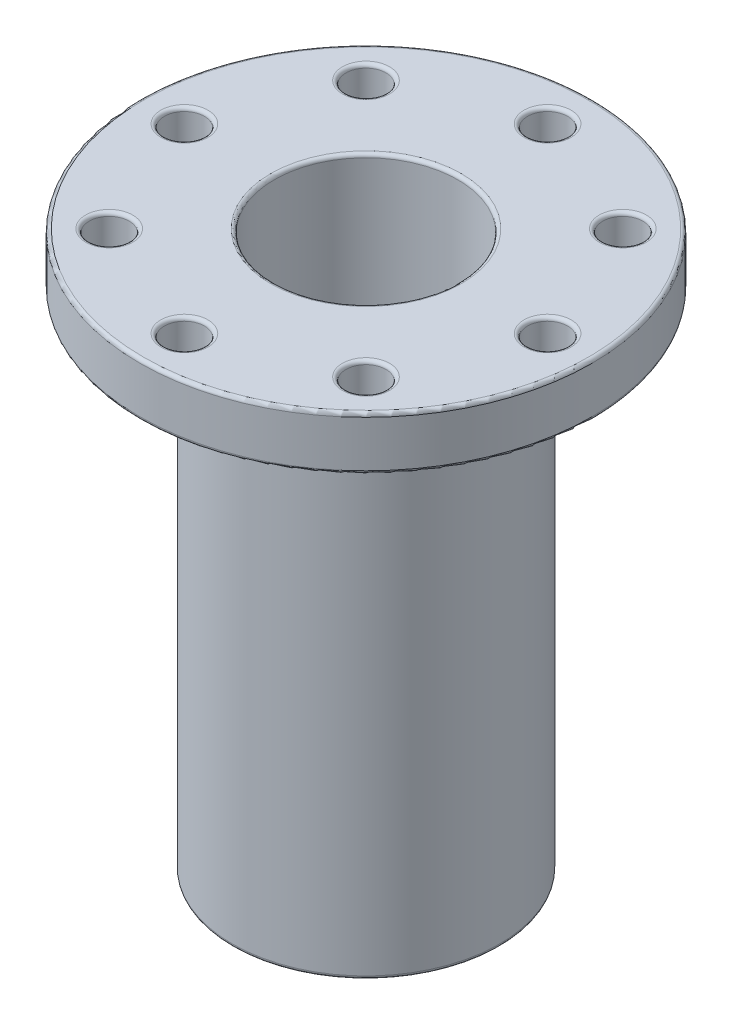
ISO-10303-21;
HEADER;
FILE_DESCRIPTION(('STEP AP214'),'2;1');
FILE_NAME('part.step','',(''),(''),'','','');
FILE_SCHEMA(('AUTOMOTIVE_DESIGN { 1 0 10303 214 1 1 1 1 }'));
ENDSEC;
DATA;
#1=APPLICATION_CONTEXT('core data for automotive mechanical design processes');
#2=APPLICATION_PROTOCOL_DEFINITION('international standard','automotive_design',2000,#1);
#3=PRODUCT_CONTEXT('',#1,'mechanical');
#4=PRODUCT('Part','Part','',(#3));
#5=PRODUCT_RELATED_PRODUCT_CATEGORY('part','',(#4));
#6=PRODUCT_DEFINITION_FORMATION('','',#4);
#7=PRODUCT_DEFINITION_CONTEXT('part definition',#1,'design');
#8=PRODUCT_DEFINITION('design','',#6,#7);
#9=PRODUCT_DEFINITION_SHAPE('','',#8);
#10=(LENGTH_UNIT() NAMED_UNIT(*) SI_UNIT(.MILLI.,.METRE.));
#11=(NAMED_UNIT(*) PLANE_ANGLE_UNIT() SI_UNIT($,.RADIAN.));
#12=(NAMED_UNIT(*) SI_UNIT($,.STERADIAN.) SOLID_ANGLE_UNIT());
#13=UNCERTAINTY_MEASURE_WITH_UNIT(LENGTH_MEASURE(1.E-05),#10,'distance_accuracy_value','');
#14=(GEOMETRIC_REPRESENTATION_CONTEXT(3) GLOBAL_UNCERTAINTY_ASSIGNED_CONTEXT((#13)) GLOBAL_UNIT_ASSIGNED_CONTEXT((#10,
#11,#12)) REPRESENTATION_CONTEXT('',''));
#15=CARTESIAN_POINT('',(0.,0.,0.));
#16=DIRECTION('',(0.,0.,1.));
#17=DIRECTION('',(1.,0.,0.));
#18=AXIS2_PLACEMENT_3D('',#15,#16,#17);
#19=CARTESIAN_POINT('',(0.,6.,0.));
#20=DIRECTION('',(0.,1.,0.));
#21=DIRECTION('',(0.,0.,1.));
#22=AXIS2_PLACEMENT_3D('',#19,#20,#21);
#23=PLANE('',#22);
#24=CARTESIAN_POINT('',(-14.4249783362056,6.,-14.4249783362056));
#25=DIRECTION('',(0.,1.,0.));
#26=DIRECTION('',(0.,0.,1.));
#27=AXIS2_PLACEMENT_3D('',#24,#25,#26);
#28=CIRCLE('',#27,2.65);
#29=CARTESIAN_POINT('',(-14.4249783362056,6.,-11.7749783362056));
#30=VERTEX_POINT('',#29);
#31=EDGE_CURVE('E191',#30,#30,#28,.F.);
#32=ORIENTED_EDGE('',*,*,#31,.T.);
#33=EDGE_LOOP('',(#32));
#34=FACE_BOUND('',#33,.T.);
#35=CARTESIAN_POINT('',(-14.4249783362056,6.,14.4249783362056));
#36=DIRECTION('',(0.,1.,0.));
#37=DIRECTION('',(0.,0.,1.));
#38=AXIS2_PLACEMENT_3D('',#35,#36,#37);
#39=CIRCLE('',#38,2.65);
#40=CARTESIAN_POINT('',(-14.4249783362056,6.,17.0749783362056));
#41=VERTEX_POINT('',#40);
#42=EDGE_CURVE('E195',#41,#41,#39,.F.);
#43=ORIENTED_EDGE('',*,*,#42,.T.);
#44=EDGE_LOOP('',(#43));
#45=FACE_BOUND('',#44,.T.);
#46=CARTESIAN_POINT('',(14.4249783362056,6.,14.4249783362056));
#47=DIRECTION('',(0.,1.,0.));
#48=DIRECTION('',(0.,0.,1.));
#49=AXIS2_PLACEMENT_3D('',#46,#47,#48);
#50=CIRCLE('',#49,2.65);
#51=CARTESIAN_POINT('',(14.4249783362056,6.,17.0749783362056));
#52=VERTEX_POINT('',#51);
#53=EDGE_CURVE('E199',#52,#52,#50,.F.);
#54=ORIENTED_EDGE('',*,*,#53,.T.);
#55=EDGE_LOOP('',(#54));
#56=FACE_BOUND('',#55,.T.);
#57=CARTESIAN_POINT('',(14.4249783362056,6.,-14.4249783362056));
#58=DIRECTION('',(0.,1.,0.));
#59=DIRECTION('',(0.,0.,1.));
#60=AXIS2_PLACEMENT_3D('',#57,#58,#59);
#61=CIRCLE('',#60,2.65);
#62=CARTESIAN_POINT('',(14.4249783362056,6.,-11.7749783362056));
#63=VERTEX_POINT('',#62);
#64=EDGE_CURVE('E203',#63,#63,#61,.F.);
#65=ORIENTED_EDGE('',*,*,#64,.T.);
#66=EDGE_LOOP('',(#65));
#67=FACE_BOUND('',#66,.T.);
#68=CARTESIAN_POINT('',(0.,6.,0.));
#69=DIRECTION('',(0.,1.,0.));
#70=DIRECTION('',(0.,0.,1.));
#71=AXIS2_PLACEMENT_3D('',#68,#69,#70);
#72=CIRCLE('',#71,25.);
#73=CARTESIAN_POINT('',(0.,6.,25.));
#74=VERTEX_POINT('',#73);
#75=EDGE_CURVE('E207',#74,#74,#72,.T.);
#76=ORIENTED_EDGE('',*,*,#75,.T.);
#77=EDGE_LOOP('',(#76));
#78=FACE_BOUND('',#77,.T.);
#79=CARTESIAN_POINT('',(0.,6.,-20.4));
#80=DIRECTION('',(0.,1.,0.));
#81=DIRECTION('',(0.,0.,1.));
#82=AXIS2_PLACEMENT_3D('',#79,#80,#81);
#83=CIRCLE('',#82,2.65);
#84=CARTESIAN_POINT('',(0.,6.,-17.75));
#85=VERTEX_POINT('',#84);
#86=EDGE_CURVE('E211',#85,#85,#83,.F.);
#87=ORIENTED_EDGE('',*,*,#86,.T.);
#88=EDGE_LOOP('',(#87));
#89=FACE_BOUND('',#88,.T.);
#90=CARTESIAN_POINT('',(20.4,6.,0.));
#91=DIRECTION('',(0.,1.,0.));
#92=DIRECTION('',(0.,0.,1.));
#93=AXIS2_PLACEMENT_3D('',#90,#91,#92);
#94=CIRCLE('',#93,2.65);
#95=CARTESIAN_POINT('',(20.4,6.,2.65));
#96=VERTEX_POINT('',#95);
#97=EDGE_CURVE('E215',#96,#96,#94,.F.);
#98=ORIENTED_EDGE('',*,*,#97,.T.);
#99=EDGE_LOOP('',(#98));
#100=FACE_BOUND('',#99,.T.);
#101=CARTESIAN_POINT('',(0.,6.,20.4));
#102=DIRECTION('',(0.,1.,0.));
#103=DIRECTION('',(0.,0.,1.));
#104=AXIS2_PLACEMENT_3D('',#101,#102,#103);
#105=CIRCLE('',#104,2.65);
#106=CARTESIAN_POINT('',(0.,6.,23.05));
#107=VERTEX_POINT('',#106);
#108=EDGE_CURVE('E219',#107,#107,#105,.F.);
#109=ORIENTED_EDGE('',*,*,#108,.T.);
#110=EDGE_LOOP('',(#109));
#111=FACE_BOUND('',#110,.T.);
#112=CARTESIAN_POINT('',(-20.4,6.,0.));
#113=DIRECTION('',(0.,1.,0.));
#114=DIRECTION('',(0.,0.,1.));
#115=AXIS2_PLACEMENT_3D('',#112,#113,#114);
#116=CIRCLE('',#115,2.65);
#117=CARTESIAN_POINT('',(-20.4,6.,2.65));
#118=VERTEX_POINT('',#117);
#119=EDGE_CURVE('E223',#118,#118,#116,.F.);
#120=ORIENTED_EDGE('',*,*,#119,.T.);
#121=EDGE_LOOP('',(#120));
#122=FACE_BOUND('',#121,.T.);
#123=CARTESIAN_POINT('',(0.,6.,0.));
#124=DIRECTION('',(0.,1.,0.));
#125=DIRECTION('',(0.,0.,1.));
#126=AXIS2_PLACEMENT_3D('',#123,#124,#125);
#127=CIRCLE('',#126,10.7125);
#128=CARTESIAN_POINT('',(0.,6.,10.7125));
#129=VERTEX_POINT('',#128);
#130=EDGE_CURVE('E227',#129,#129,#127,.F.);
#131=ORIENTED_EDGE('',*,*,#130,.T.);
#132=EDGE_LOOP('',(#131));
#133=FACE_BOUND('',#132,.T.);
#134=ADVANCED_FACE('F39',(#34,#45,#56,#67,#78,#89,#100,#111,#122,#133),#23,.T.);
#135=CARTESIAN_POINT('',(0.,0.,0.));
#136=DIRECTION('',(0.,1.,0.));
#137=DIRECTION('',(0.,0.,1.));
#138=AXIS2_PLACEMENT_3D('',#135,#136,#137);
#139=PLANE('',#138);
#140=CARTESIAN_POINT('',(-14.4249783362056,0.,-14.4249783362056));
#141=DIRECTION('',(0.,1.,0.));
#142=DIRECTION('',(0.,0.,1.));
#143=AXIS2_PLACEMENT_3D('',#140,#141,#142);
#144=CIRCLE('',#143,2.65);
#145=CARTESIAN_POINT('',(-14.4249783362056,0.,-11.7749783362056));
#146=VERTEX_POINT('',#145);
#147=EDGE_CURVE('E87',#146,#146,#144,.T.);
#148=ORIENTED_EDGE('',*,*,#147,.T.);
#149=EDGE_LOOP('',(#148));
#150=FACE_BOUND('',#149,.T.);
#151=CARTESIAN_POINT('',(-20.4,0.,0.));
#152=DIRECTION('',(0.,1.,0.));
#153=DIRECTION('',(0.,0.,1.));
#154=AXIS2_PLACEMENT_3D('',#151,#152,#153);
#155=CIRCLE('',#154,2.65);
#156=CARTESIAN_POINT('',(-20.4,0.,2.65));
#157=VERTEX_POINT('',#156);
#158=EDGE_CURVE('E91',#157,#157,#155,.T.);
#159=ORIENTED_EDGE('',*,*,#158,.T.);
#160=EDGE_LOOP('',(#159));
#161=FACE_BOUND('',#160,.T.);
#162=CARTESIAN_POINT('',(-14.4249783362056,0.,14.4249783362056));
#163=DIRECTION('',(0.,1.,0.));
#164=DIRECTION('',(0.,0.,1.));
#165=AXIS2_PLACEMENT_3D('',#162,#163,#164);
#166=CIRCLE('',#165,2.65);
#167=CARTESIAN_POINT('',(-14.4249783362056,0.,17.0749783362056));
#168=VERTEX_POINT('',#167);
#169=EDGE_CURVE('E95',#168,#168,#166,.T.);
#170=ORIENTED_EDGE('',*,*,#169,.T.);
#171=EDGE_LOOP('',(#170));
#172=FACE_BOUND('',#171,.T.);
#173=CARTESIAN_POINT('',(0.,0.,20.4));
#174=DIRECTION('',(0.,1.,0.));
#175=DIRECTION('',(0.,0.,1.));
#176=AXIS2_PLACEMENT_3D('',#173,#174,#175);
#177=CIRCLE('',#176,2.65);
#178=CARTESIAN_POINT('',(0.,0.,23.05));
#179=VERTEX_POINT('',#178);
#180=EDGE_CURVE('E99',#179,#179,#177,.T.);
#181=ORIENTED_EDGE('',*,*,#180,.T.);
#182=EDGE_LOOP('',(#181));
#183=FACE_BOUND('',#182,.T.);
#184=CARTESIAN_POINT('',(14.4249783362056,0.,14.4249783362056));
#185=DIRECTION('',(0.,1.,0.));
#186=DIRECTION('',(0.,0.,1.));
#187=AXIS2_PLACEMENT_3D('',#184,#185,#186);
#188=CIRCLE('',#187,2.65);
#189=CARTESIAN_POINT('',(14.4249783362056,0.,17.0749783362056));
#190=VERTEX_POINT('',#189);
#191=EDGE_CURVE('E103',#190,#190,#188,.T.);
#192=ORIENTED_EDGE('',*,*,#191,.T.);
#193=EDGE_LOOP('',(#192));
#194=FACE_BOUND('',#193,.T.);
#195=CARTESIAN_POINT('',(20.4,0.,0.));
#196=DIRECTION('',(0.,1.,0.));
#197=DIRECTION('',(0.,0.,1.));
#198=AXIS2_PLACEMENT_3D('',#195,#196,#197);
#199=CIRCLE('',#198,2.65);
#200=CARTESIAN_POINT('',(20.4,0.,2.65));
#201=VERTEX_POINT('',#200);
#202=EDGE_CURVE('E107',#201,#201,#199,.T.);
#203=ORIENTED_EDGE('',*,*,#202,.T.);
#204=EDGE_LOOP('',(#203));
#205=FACE_BOUND('',#204,.T.);
#206=CARTESIAN_POINT('',(14.4249783362056,0.,-14.4249783362056));
#207=DIRECTION('',(0.,1.,0.));
#208=DIRECTION('',(0.,0.,1.));
#209=AXIS2_PLACEMENT_3D('',#206,#207,#208);
#210=CIRCLE('',#209,2.65);
#211=CARTESIAN_POINT('',(14.4249783362056,0.,-11.7749783362056));
#212=VERTEX_POINT('',#211);
#213=EDGE_CURVE('E111',#212,#212,#210,.T.);
#214=ORIENTED_EDGE('',*,*,#213,.T.);
#215=EDGE_LOOP('',(#214));
#216=FACE_BOUND('',#215,.T.);
#217=CARTESIAN_POINT('',(0.,0.,-20.4));
#218=DIRECTION('',(0.,1.,0.));
#219=DIRECTION('',(0.,0.,1.));
#220=AXIS2_PLACEMENT_3D('',#217,#218,#219);
#221=CIRCLE('',#220,2.65);
#222=CARTESIAN_POINT('',(0.,0.,-17.75));
#223=VERTEX_POINT('',#222);
#224=EDGE_CURVE('E115',#223,#223,#221,.T.);
#225=ORIENTED_EDGE('',*,*,#224,.T.);
#226=EDGE_LOOP('',(#225));
#227=FACE_BOUND('',#226,.T.);
#228=CARTESIAN_POINT('',(0.,0.,0.));
#229=DIRECTION('',(0.,1.,0.));
#230=DIRECTION('',(0.,0.,1.));
#231=AXIS2_PLACEMENT_3D('',#228,#229,#230);
#232=CIRCLE('',#231,25.);
#233=CARTESIAN_POINT('',(0.,0.,25.));
#234=VERTEX_POINT('',#233);
#235=EDGE_CURVE('E119',#234,#234,#232,.F.);
#236=ORIENTED_EDGE('',*,*,#235,.T.);
#237=EDGE_LOOP('',(#236));
#238=FACE_BOUND('',#237,.T.);
#239=CARTESIAN_POINT('',(0.,0.,0.));
#240=DIRECTION('',(0.,1.,0.));
#241=DIRECTION('',(0.,0.,1.));
#242=AXIS2_PLACEMENT_3D('',#239,#240,#241);
#243=CIRCLE('',#242,15.4);
#244=CARTESIAN_POINT('',(0.,0.,15.4));
#245=VERTEX_POINT('',#244);
#246=EDGE_CURVE('E123',#245,#245,#243,.T.);
#247=ORIENTED_EDGE('',*,*,#246,.T.);
#248=EDGE_LOOP('',(#247));
#249=FACE_BOUND('',#248,.T.);
#250=ADVANCED_FACE('F250',(#150,#161,#172,#183,#194,#205,#216,#227,#238,#249),#139,.F.);
#251=CARTESIAN_POINT('',(0.,6.,0.));
#252=DIRECTION('',(0.,-1.,0.));
#253=DIRECTION('',(0.,0.,-1.));
#254=AXIS2_PLACEMENT_3D('',#251,#252,#253);
#255=CYLINDRICAL_SURFACE('',#254,25.4);
#256=CARTESIAN_POINT('',(0.,5.6,0.));
#257=DIRECTION('',(0.,1.,0.));
#258=DIRECTION('',(0.,0.,1.));
#259=AXIS2_PLACEMENT_3D('',#256,#257,#258);
#260=CIRCLE('',#259,25.4);
#261=CARTESIAN_POINT('',(0.,5.6,25.4));
#262=VERTEX_POINT('',#261);
#263=EDGE_CURVE('E159',#262,#262,#260,.F.);
#264=ORIENTED_EDGE('',*,*,#263,.T.);
#265=EDGE_LOOP('',(#264));
#266=FACE_BOUND('',#265,.T.);
#267=CARTESIAN_POINT('',(0.,0.4,0.));
#268=DIRECTION('',(0.,1.,0.));
#269=DIRECTION('',(0.,0.,1.));
#270=AXIS2_PLACEMENT_3D('',#267,#268,#269);
#271=CIRCLE('',#270,25.4);
#272=CARTESIAN_POINT('',(0.,0.4,25.4));
#273=VERTEX_POINT('',#272);
#274=EDGE_CURVE('E163',#273,#273,#271,.T.);
#275=ORIENTED_EDGE('',*,*,#274,.T.);
#276=EDGE_LOOP('',(#275));
#277=FACE_BOUND('',#276,.T.);
#278=ADVANCED_FACE('F253',(#266,#277),#255,.T.);
#279=CARTESIAN_POINT('',(0.,6.,-20.4));
#280=DIRECTION('',(0.,-1.,0.));
#281=DIRECTION('',(0.,0.,-1.));
#282=AXIS2_PLACEMENT_3D('',#279,#280,#281);
#283=CYLINDRICAL_SURFACE('',#282,2.25);
#284=CARTESIAN_POINT('',(0.,5.6,-20.4));
#285=DIRECTION('',(0.,1.,0.));
#286=DIRECTION('',(0.,0.,1.));
#287=AXIS2_PLACEMENT_3D('',#284,#285,#286);
#288=CIRCLE('',#287,2.25);
#289=CARTESIAN_POINT('',(0.,5.6,-18.15));
#290=VERTEX_POINT('',#289);
#291=EDGE_CURVE('E151',#290,#290,#288,.T.);
#292=ORIENTED_EDGE('',*,*,#291,.T.);
#293=EDGE_LOOP('',(#292));
#294=FACE_BOUND('',#293,.T.);
#295=CARTESIAN_POINT('',(0.,0.4,-20.4));
#296=DIRECTION('',(0.,1.,0.));
#297=DIRECTION('',(0.,0.,1.));
#298=AXIS2_PLACEMENT_3D('',#295,#296,#297);
#299=CIRCLE('',#298,2.25);
#300=CARTESIAN_POINT('',(0.,0.4,-18.15));
#301=VERTEX_POINT('',#300);
#302=EDGE_CURVE('E155',#301,#301,#299,.F.);
#303=ORIENTED_EDGE('',*,*,#302,.T.);
#304=EDGE_LOOP('',(#303));
#305=FACE_BOUND('',#304,.T.);
#306=ADVANCED_FACE('F297',(#294,#305),#283,.F.);
#307=CARTESIAN_POINT('',(14.4249783362056,6.,-14.4249783362056));
#308=DIRECTION('',(0.,-1.,0.));
#309=DIRECTION('',(0.,0.,-1.));
#310=AXIS2_PLACEMENT_3D('',#307,#308,#309);
#311=CYLINDRICAL_SURFACE('',#310,2.25);
#312=CARTESIAN_POINT('',(14.4249783362056,5.6,-14.4249783362056));
#313=DIRECTION('',(0.,1.,0.));
#314=DIRECTION('',(0.,0.,1.));
#315=AXIS2_PLACEMENT_3D('',#312,#313,#314);
#316=CIRCLE('',#315,2.25);
#317=CARTESIAN_POINT('',(14.4249783362056,5.6,-12.1749783362056));
#318=VERTEX_POINT('',#317);
#319=EDGE_CURVE('E167',#318,#318,#316,.T.);
#320=ORIENTED_EDGE('',*,*,#319,.T.);
#321=EDGE_LOOP('',(#320));
#322=FACE_BOUND('',#321,.T.);
#323=CARTESIAN_POINT('',(14.4249783362056,0.4,-14.4249783362056));
#324=DIRECTION('',(0.,1.,0.));
#325=DIRECTION('',(0.,0.,1.));
#326=AXIS2_PLACEMENT_3D('',#323,#324,#325);
#327=CIRCLE('',#326,2.25);
#328=CARTESIAN_POINT('',(14.4249783362056,0.4,-12.1749783362056));
#329=VERTEX_POINT('',#328);
#330=EDGE_CURVE('E171',#329,#329,#327,.F.);
#331=ORIENTED_EDGE('',*,*,#330,.T.);
#332=EDGE_LOOP('',(#331));
#333=FACE_BOUND('',#332,.T.);
#334=ADVANCED_FACE('F370',(#322,#333),#311,.F.);
#335=CARTESIAN_POINT('',(20.4,6.,0.));
#336=DIRECTION('',(0.,-1.,0.));
#337=DIRECTION('',(0.,0.,-1.));
#338=AXIS2_PLACEMENT_3D('',#335,#336,#337);
#339=CYLINDRICAL_SURFACE('',#338,2.25);
#340=CARTESIAN_POINT('',(20.4,5.6,0.));
#341=DIRECTION('',(0.,1.,0.));
#342=DIRECTION('',(0.,0.,1.));
#343=AXIS2_PLACEMENT_3D('',#340,#341,#342);
#344=CIRCLE('',#343,2.25);
#345=CARTESIAN_POINT('',(20.4,5.6,2.25));
#346=VERTEX_POINT('',#345);
#347=EDGE_CURVE('E143',#346,#346,#344,.T.);
#348=ORIENTED_EDGE('',*,*,#347,.T.);
#349=EDGE_LOOP('',(#348));
#350=FACE_BOUND('',#349,.T.);
#351=CARTESIAN_POINT('',(20.4,0.4,0.));
#352=DIRECTION('',(0.,1.,0.));
#353=DIRECTION('',(0.,0.,1.));
#354=AXIS2_PLACEMENT_3D('',#351,#352,#353);
#355=CIRCLE('',#354,2.25);
#356=CARTESIAN_POINT('',(20.4,0.4,2.25));
#357=VERTEX_POINT('',#356);
#358=EDGE_CURVE('E147',#357,#357,#355,.F.);
#359=ORIENTED_EDGE('',*,*,#358,.T.);
#360=EDGE_LOOP('',(#359));
#361=FACE_BOUND('',#360,.T.);
#362=ADVANCED_FACE('F375',(#350,#361),#339,.F.);
#363=CARTESIAN_POINT('',(14.4249783362056,6.,14.4249783362056));
#364=DIRECTION('',(0.,-1.,0.));
#365=DIRECTION('',(0.,0.,-1.));
#366=AXIS2_PLACEMENT_3D('',#363,#364,#365);
#367=CYLINDRICAL_SURFACE('',#366,2.25);
#368=CARTESIAN_POINT('',(14.4249783362056,5.6,14.4249783362056));
#369=DIRECTION('',(0.,1.,0.));
#370=DIRECTION('',(0.,0.,1.));
#371=AXIS2_PLACEMENT_3D('',#368,#369,#370);
#372=CIRCLE('',#371,2.25);
#373=CARTESIAN_POINT('',(14.4249783362056,5.6,16.6749783362056));
#374=VERTEX_POINT('',#373);
#375=EDGE_CURVE('E175',#374,#374,#372,.T.);
#376=ORIENTED_EDGE('',*,*,#375,.T.);
#377=EDGE_LOOP('',(#376));
#378=FACE_BOUND('',#377,.T.);
#379=CARTESIAN_POINT('',(14.4249783362056,0.4,14.4249783362056));
#380=DIRECTION('',(0.,1.,0.));
#381=DIRECTION('',(0.,0.,1.));
#382=AXIS2_PLACEMENT_3D('',#379,#380,#381);
#383=CIRCLE('',#382,2.25);
#384=CARTESIAN_POINT('',(14.4249783362056,0.4,16.6749783362056));
#385=VERTEX_POINT('',#384);
#386=EDGE_CURVE('E179',#385,#385,#383,.F.);
#387=ORIENTED_EDGE('',*,*,#386,.T.);
#388=EDGE_LOOP('',(#387));
#389=FACE_BOUND('',#388,.T.);
#390=ADVANCED_FACE('F382',(#378,#389),#367,.F.);
#391=CARTESIAN_POINT('',(0.,6.,20.4));
#392=DIRECTION('',(0.,-1.,0.));
#393=DIRECTION('',(0.,0.,-1.));
#394=AXIS2_PLACEMENT_3D('',#391,#392,#393);
#395=CYLINDRICAL_SURFACE('',#394,2.25);
#396=CARTESIAN_POINT('',(0.,5.6,20.4));
#397=DIRECTION('',(0.,1.,0.));
#398=DIRECTION('',(0.,0.,1.));
#399=AXIS2_PLACEMENT_3D('',#396,#397,#398);
#400=CIRCLE('',#399,2.25);
#401=CARTESIAN_POINT('',(0.,5.6,22.65));
#402=VERTEX_POINT('',#401);
#403=EDGE_CURVE('E135',#402,#402,#400,.T.);
#404=ORIENTED_EDGE('',*,*,#403,.T.);
#405=EDGE_LOOP('',(#404));
#406=FACE_BOUND('',#405,.T.);
#407=CARTESIAN_POINT('',(0.,0.4,20.4));
#408=DIRECTION('',(0.,1.,0.));
#409=DIRECTION('',(0.,0.,1.));
#410=AXIS2_PLACEMENT_3D('',#407,#408,#409);
#411=CIRCLE('',#410,2.25);
#412=CARTESIAN_POINT('',(0.,0.4,22.65));
#413=VERTEX_POINT('',#412);
#414=EDGE_CURVE('E139',#413,#413,#411,.F.);
#415=ORIENTED_EDGE('',*,*,#414,.T.);
#416=EDGE_LOOP('',(#415));
#417=FACE_BOUND('',#416,.T.);
#418=ADVANCED_FACE('F389',(#406,#417),#395,.F.);
#419=CARTESIAN_POINT('',(-14.4249783362056,6.,14.4249783362056));
#420=DIRECTION('',(0.,-1.,0.));
#421=DIRECTION('',(0.,0.,-1.));
#422=AXIS2_PLACEMENT_3D('',#419,#420,#421);
#423=CYLINDRICAL_SURFACE('',#422,2.25);
#424=CARTESIAN_POINT('',(-14.4249783362056,5.6,14.4249783362056));
#425=DIRECTION('',(0.,1.,0.));
#426=DIRECTION('',(0.,0.,1.));
#427=AXIS2_PLACEMENT_3D('',#424,#425,#426);
#428=CIRCLE('',#427,2.25);
#429=CARTESIAN_POINT('',(-14.4249783362056,5.6,16.6749783362056));
#430=VERTEX_POINT('',#429);
#431=EDGE_CURVE('E183',#430,#430,#428,.T.);
#432=ORIENTED_EDGE('',*,*,#431,.T.);
#433=EDGE_LOOP('',(#432));
#434=FACE_BOUND('',#433,.T.);
#435=CARTESIAN_POINT('',(-14.4249783362056,0.4,14.4249783362056));
#436=DIRECTION('',(0.,1.,0.));
#437=DIRECTION('',(0.,0.,1.));
#438=AXIS2_PLACEMENT_3D('',#435,#436,#437);
#439=CIRCLE('',#438,2.25);
#440=CARTESIAN_POINT('',(-14.4249783362056,0.4,16.6749783362056));
#441=VERTEX_POINT('',#440);
#442=EDGE_CURVE('E187',#441,#441,#439,.F.);
#443=ORIENTED_EDGE('',*,*,#442,.T.);
#444=EDGE_LOOP('',(#443));
#445=FACE_BOUND('',#444,.T.);
#446=ADVANCED_FACE('F393',(#434,#445),#423,.F.);
#447=CARTESIAN_POINT('',(-20.4,6.,0.));
#448=DIRECTION('',(0.,-1.,0.));
#449=DIRECTION('',(0.,0.,-1.));
#450=AXIS2_PLACEMENT_3D('',#447,#448,#449);
#451=CYLINDRICAL_SURFACE('',#450,2.25);
#452=CARTESIAN_POINT('',(-20.4,5.6,0.));
#453=DIRECTION('',(0.,1.,0.));
#454=DIRECTION('',(0.,0.,1.));
#455=AXIS2_PLACEMENT_3D('',#452,#453,#454);
#456=CIRCLE('',#455,2.25);
#457=CARTESIAN_POINT('',(-20.4,5.6,2.25));
#458=VERTEX_POINT('',#457);
#459=EDGE_CURVE('E127',#458,#458,#456,.T.);
#460=ORIENTED_EDGE('',*,*,#459,.T.);
#461=EDGE_LOOP('',(#460));
#462=FACE_BOUND('',#461,.T.);
#463=CARTESIAN_POINT('',(-20.4,0.4,0.));
#464=DIRECTION('',(0.,1.,0.));
#465=DIRECTION('',(0.,0.,1.));
#466=AXIS2_PLACEMENT_3D('',#463,#464,#465);
#467=CIRCLE('',#466,2.25);
#468=CARTESIAN_POINT('',(-20.4,0.4,2.25));
#469=VERTEX_POINT('',#468);
#470=EDGE_CURVE('E131',#469,#469,#467,.F.);
#471=ORIENTED_EDGE('',*,*,#470,.T.);
#472=EDGE_LOOP('',(#471));
#473=FACE_BOUND('',#472,.T.);
#474=ADVANCED_FACE('F397',(#462,#473),#451,.F.);
#475=CARTESIAN_POINT('',(-14.4249783362056,6.,-14.4249783362056));
#476=DIRECTION('',(0.,-1.,0.));
#477=DIRECTION('',(0.,0.,-1.));
#478=AXIS2_PLACEMENT_3D('',#475,#476,#477);
#479=CYLINDRICAL_SURFACE('',#478,2.25);
#480=CARTESIAN_POINT('',(-14.4249783362056,5.6,-14.4249783362056));
#481=DIRECTION('',(0.,1.,0.));
#482=DIRECTION('',(0.,0.,1.));
#483=AXIS2_PLACEMENT_3D('',#480,#481,#482);
#484=CIRCLE('',#483,2.25);
#485=CARTESIAN_POINT('',(-14.4249783362056,5.6,-12.1749783362056));
#486=VERTEX_POINT('',#485);
#487=EDGE_CURVE('E231',#486,#486,#484,.T.);
#488=ORIENTED_EDGE('',*,*,#487,.T.);
#489=EDGE_LOOP('',(#488));
#490=FACE_BOUND('',#489,.T.);
#491=CARTESIAN_POINT('',(-14.4249783362056,0.4,-14.4249783362056));
#492=DIRECTION('',(0.,1.,0.));
#493=DIRECTION('',(0.,0.,1.));
#494=AXIS2_PLACEMENT_3D('',#491,#492,#493);
#495=CIRCLE('',#494,2.25);
#496=CARTESIAN_POINT('',(-14.4249783362056,0.4,-12.1749783362056));
#497=VERTEX_POINT('',#496);
#498=EDGE_CURVE('E235',#497,#497,#495,.F.);
#499=ORIENTED_EDGE('',*,*,#498,.T.);
#500=EDGE_LOOP('',(#499));
#501=FACE_BOUND('',#500,.T.);
#502=ADVANCED_FACE('F240',(#490,#501),#479,.F.);
#503=CARTESIAN_POINT('',(0.,-56.5,0.));
#504=DIRECTION('',(0.,1.,0.));
#505=DIRECTION('',(0.,0.,1.));
#506=AXIS2_PLACEMENT_3D('',#503,#504,#505);
#507=CYLINDRICAL_SURFACE('',#506,15.);
#508=CARTESIAN_POINT('',(0.,-0.399999999999998,0.));
#509=DIRECTION('',(0.,1.,0.));
#510=DIRECTION('',(0.,0.,1.));
#511=AXIS2_PLACEMENT_3D('',#508,#509,#510);
#512=CIRCLE('',#511,15.);
#513=CARTESIAN_POINT('',(0.,-0.399999999999998,15.));
#514=VERTEX_POINT('',#513);
#515=EDGE_CURVE('E79',#514,#514,#512,.F.);
#516=ORIENTED_EDGE('',*,*,#515,.T.);
#517=EDGE_LOOP('',(#516));
#518=FACE_BOUND('',#517,.T.);
#519=CARTESIAN_POINT('',(0.,-56.1,0.));
#520=DIRECTION('',(0.,1.,0.));
#521=DIRECTION('',(0.,0.,1.));
#522=AXIS2_PLACEMENT_3D('',#519,#520,#521);
#523=CIRCLE('',#522,15.);
#524=CARTESIAN_POINT('',(0.,-56.1,15.));
#525=VERTEX_POINT('',#524);
#526=EDGE_CURVE('E83',#525,#525,#523,.T.);
#527=ORIENTED_EDGE('',*,*,#526,.T.);
#528=EDGE_LOOP('',(#527));
#529=FACE_BOUND('',#528,.T.);
#530=ADVANCED_FACE('F404',(#518,#529),#507,.T.);
#531=CARTESIAN_POINT('',(0.,-56.5,0.));
#532=DIRECTION('',(0.,1.,0.));
#533=DIRECTION('',(0.,0.,1.));
#534=AXIS2_PLACEMENT_3D('',#531,#532,#533);
#535=PLANE('',#534);
#536=CARTESIAN_POINT('',(0.,-56.5,0.));
#537=DIRECTION('',(0.,1.,0.));
#538=DIRECTION('',(0.,0.,1.));
#539=AXIS2_PLACEMENT_3D('',#536,#537,#538);
#540=CIRCLE('',#539,14.6);
#541=CARTESIAN_POINT('',(0.,-56.5,14.6));
#542=VERTEX_POINT('',#541);
#543=EDGE_CURVE('E71',#542,#542,#540,.F.);
#544=ORIENTED_EDGE('',*,*,#543,.T.);
#545=EDGE_LOOP('',(#544));
#546=FACE_BOUND('',#545,.T.);
#547=CARTESIAN_POINT('',(0.,-56.5,0.));
#548=DIRECTION('',(0.,1.,0.));
#549=DIRECTION('',(0.,0.,1.));
#550=AXIS2_PLACEMENT_3D('',#547,#548,#549);
#551=CIRCLE('',#550,7.47);
#552=CARTESIAN_POINT('',(0.,-56.5,7.47));
#553=VERTEX_POINT('',#552);
#554=EDGE_CURVE('E75',#553,#553,#551,.T.);
#555=ORIENTED_EDGE('',*,*,#554,.T.);
#556=EDGE_LOOP('',(#555));
#557=FACE_BOUND('',#556,.T.);
#558=ADVANCED_FACE('F408',(#546,#557),#535,.F.);
#559=CARTESIAN_POINT('',(0.,-32.1,0.));
#560=DIRECTION('',(0.,1.,0.));
#561=DIRECTION('',(0.,0.,1.));
#562=AXIS2_PLACEMENT_3D('',#559,#560,#561);
#563=CYLINDRICAL_SURFACE('',#562,10.3125);
#564=CARTESIAN_POINT('',(0.,5.6,0.));
#565=DIRECTION('',(0.,1.,0.));
#566=DIRECTION('',(0.,0.,1.));
#567=AXIS2_PLACEMENT_3D('',#564,#565,#566);
#568=CIRCLE('',#567,10.3125);
#569=CARTESIAN_POINT('',(0.,5.6,10.3125));
#570=VERTEX_POINT('',#569);
#571=EDGE_CURVE('E10',#570,#570,#568,.T.);
#572=CARTESIAN_POINT('',(0.,-31.7,0.));
#573=DIRECTION('',(0.,1.,0.));
#574=DIRECTION('',(0.,0.,1.));
#575=AXIS2_PLACEMENT_3D('',#572,#573,#574);
#576=CIRCLE('',#575,10.3125);
#577=CARTESIAN_POINT('',(0.,-31.7,10.3125));
#578=VERTEX_POINT('',#577);
#579=EDGE_CURVE('E47',#578,#578,#576,.F.);
#580=CARTESIAN_POINT('',(0.,5.6,10.3125));
#581=CARTESIAN_POINT('',(0.,5.21145833333333,10.3125));
#582=CARTESIAN_POINT('',(0.,4.82291666666667,10.3125));
#583=CARTESIAN_POINT('',(0.,4.04583333333333,10.3125));
#584=CARTESIAN_POINT('',(0.,3.65729166666667,10.3125));
#585=CARTESIAN_POINT('',(0.,2.88020833333333,10.3125));
#586=CARTESIAN_POINT('',(0.,2.49166666666666,10.3125));
#587=CARTESIAN_POINT('',(0.,1.71458333333333,10.3125));
#588=CARTESIAN_POINT('',(0.,1.32604166666667,10.3125));
#589=CARTESIAN_POINT('',(0.,0.548958333333333,10.3125));
#590=CARTESIAN_POINT('',(0.,0.160416666666665,10.3125));
#591=CARTESIAN_POINT('',(0.,-0.616666666666668,10.3125));
#592=CARTESIAN_POINT('',(0.,-1.00520833333333,10.3125));
#593=CARTESIAN_POINT('',(0.,-1.78229166666667,10.3125));
#594=CARTESIAN_POINT('',(0.,-2.17083333333333,10.3125));
#595=CARTESIAN_POINT('',(0.,-2.94791666666667,10.3125));
#596=CARTESIAN_POINT('',(0.,-3.33645833333333,10.3125));
#597=CARTESIAN_POINT('',(0.,-4.11354166666667,10.3125));
#598=CARTESIAN_POINT('',(0.,-4.50208333333333,10.3125));
#599=CARTESIAN_POINT('',(0.,-5.27916666666667,10.3125));
#600=CARTESIAN_POINT('',(0.,-5.66770833333333,10.3125));
#601=CARTESIAN_POINT('',(0.,-6.44479166666667,10.3125));
#602=CARTESIAN_POINT('',(0.,-6.83333333333333,10.3125));
#603=CARTESIAN_POINT('',(0.,-7.61041666666667,10.3125));
#604=CARTESIAN_POINT('',(0.,-7.99895833333334,10.3125));
#605=CARTESIAN_POINT('',(0.,-8.77604166666667,10.3125));
#606=CARTESIAN_POINT('',(0.,-9.16458333333333,10.3125));
#607=CARTESIAN_POINT('',(0.,-9.94166666666667,10.3125));
#608=CARTESIAN_POINT('',(0.,-10.3302083333333,10.3125));
#609=CARTESIAN_POINT('',(0.,-11.1072916666667,10.3125));
#610=CARTESIAN_POINT('',(0.,-11.4958333333333,10.3125));
#611=CARTESIAN_POINT('',(0.,-12.2729166666667,10.3125));
#612=CARTESIAN_POINT('',(0.,-12.6614583333333,10.3125));
#613=CARTESIAN_POINT('',(0.,-13.4385416666667,10.3125));
#614=CARTESIAN_POINT('',(0.,-13.8270833333333,10.3125));
#615=CARTESIAN_POINT('',(0.,-14.6041666666667,10.3125));
#616=CARTESIAN_POINT('',(0.,-14.9927083333333,10.3125));
#617=CARTESIAN_POINT('',(0.,-15.7697916666667,10.3125));
#618=CARTESIAN_POINT('',(0.,-16.1583333333333,10.3125));
#619=CARTESIAN_POINT('',(0.,-16.9354166666667,10.3125));
#620=CARTESIAN_POINT('',(0.,-17.3239583333333,10.3125));
#621=CARTESIAN_POINT('',(0.,-18.1010416666667,10.3125));
#622=CARTESIAN_POINT('',(0.,-18.4895833333333,10.3125));
#623=CARTESIAN_POINT('',(0.,-19.2666666666667,10.3125));
#624=CARTESIAN_POINT('',(0.,-19.6552083333333,10.3125));
#625=CARTESIAN_POINT('',(0.,-20.4322916666667,10.3125));
#626=CARTESIAN_POINT('',(0.,-20.8208333333333,10.3125));
#627=CARTESIAN_POINT('',(0.,-21.5979166666667,10.3125));
#628=CARTESIAN_POINT('',(0.,-21.9864583333333,10.3125));
#629=CARTESIAN_POINT('',(0.,-22.7635416666667,10.3125));
#630=CARTESIAN_POINT('',(0.,-23.1520833333333,10.3125));
#631=CARTESIAN_POINT('',(0.,-23.9291666666667,10.3125));
#632=CARTESIAN_POINT('',(0.,-24.3177083333333,10.3125));
#633=CARTESIAN_POINT('',(0.,-25.0947916666667,10.3125));
#634=CARTESIAN_POINT('',(0.,-25.4833333333333,10.3125));
#635=CARTESIAN_POINT('',(0.,-26.2604166666667,10.3125));
#636=CARTESIAN_POINT('',(0.,-26.6489583333333,10.3125));
#637=CARTESIAN_POINT('',(0.,-27.4260416666667,10.3125));
#638=CARTESIAN_POINT('',(0.,-27.8145833333333,10.3125));
#639=CARTESIAN_POINT('',(0.,-28.5916666666667,10.3125));
#640=CARTESIAN_POINT('',(0.,-28.9802083333333,10.3125));
#641=CARTESIAN_POINT('',(0.,-29.7572916666667,10.3125));
#642=CARTESIAN_POINT('',(0.,-30.1458333333333,10.3125));
#643=CARTESIAN_POINT('',(0.,-30.9229166666667,10.3125));
#644=CARTESIAN_POINT('',(0.,-31.3114583333333,10.3125));
#645=CARTESIAN_POINT('',(0.,-31.7,10.3125));
#646=B_SPLINE_CURVE_WITH_KNOTS('',3,(#580,#581,#582,#583,#584,#585,#586,#587,#588,#589,#590,
#591,#592,#593,#594,#595,#596,#597,#598,#599,#600,#601,#602,#603,#604,#605,#606,#607,#608,#609,
#610,#611,#612,#613,#614,#615,#616,#617,#618,#619,#620,#621,#622,#623,#624,#625,#626,#627,#628,
#629,#630,#631,#632,#633,#634,#635,#636,#637,#638,#639,#640,#641,#642,#643,#644,#645),
.UNSPECIFIED.,.F.,.F.,(4,2,2,2,2,2,2,2,2,2,2,2,2,2,2,2,2,2,2,2,2,2,2,2,2,2,2,2,2,2,2,2,4),(0.,
1.165625,2.33125,3.496875,4.6625,5.828125,6.99375,8.159375,9.325,10.490625,11.65625,12.821875,
13.9875,15.153125,16.31875,17.484375,18.65,19.815625,20.98125,22.146875,23.3125,24.478125,
25.64375,26.809375,27.975,29.140625,30.30625,31.471875,32.6375,33.803125,34.96875,36.134375,
37.3),.UNSPECIFIED.);
#647=EDGE_CURVE('BSEAM412',#570,#578,#646,.T.);
#648=ORIENTED_EDGE('',*,*,#571,.T.);
#649=ORIENTED_EDGE('',*,*,#579,.T.);
#650=ORIENTED_EDGE('',*,*,#647,.T.);
#651=ORIENTED_EDGE('',*,*,#647,.F.);
#652=EDGE_LOOP('',(#648,#650,#649,#651));
#653=FACE_BOUND('',#652,.T.);
#654=ADVANCED_FACE('F412',(#653),#563,.F.);
#655=CARTESIAN_POINT('',(0.,-32.1,0.));
#656=DIRECTION('',(0.,1.,0.));
#657=DIRECTION('',(0.,0.,1.));
#658=AXIS2_PLACEMENT_3D('',#655,#656,#657);
#659=PLANE('',#658);
#660=CARTESIAN_POINT('',(0.,-32.1,0.));
#661=DIRECTION('',(0.,1.,0.));
#662=DIRECTION('',(0.,0.,1.));
#663=AXIS2_PLACEMENT_3D('',#660,#661,#662);
#664=CIRCLE('',#663,7.47);
#665=CARTESIAN_POINT('',(0.,-32.1,7.47));
#666=VERTEX_POINT('',#665);
#667=EDGE_CURVE('E52',#666,#666,#664,.F.);
#668=ORIENTED_EDGE('',*,*,#667,.T.);
#669=EDGE_LOOP('',(#668));
#670=FACE_BOUND('',#669,.T.);
#671=CARTESIAN_POINT('',(0.,-32.1,0.));
#672=DIRECTION('',(0.,1.,0.));
#673=DIRECTION('',(0.,0.,1.));
#674=AXIS2_PLACEMENT_3D('',#671,#672,#673);
#675=CIRCLE('',#674,9.9125);
#676=CARTESIAN_POINT('',(0.,-32.1,9.9125));
#677=VERTEX_POINT('',#676);
#678=EDGE_CURVE('E57',#677,#677,#675,.T.);
#679=ORIENTED_EDGE('',*,*,#678,.T.);
#680=EDGE_LOOP('',(#679));
#681=FACE_BOUND('',#680,.T.);
#682=ADVANCED_FACE('F416',(#670,#681),#659,.T.);
#683=CARTESIAN_POINT('',(0.,6.,0.));
#684=DIRECTION('',(0.,-1.,0.));
#685=DIRECTION('',(0.,0.,-1.));
#686=AXIS2_PLACEMENT_3D('',#683,#684,#685);
#687=CYLINDRICAL_SURFACE('',#686,7.07);
#688=CARTESIAN_POINT('',(0.,-56.1,0.));
#689=DIRECTION('',(0.,1.,0.));
#690=DIRECTION('',(0.,0.,1.));
#691=AXIS2_PLACEMENT_3D('',#688,#689,#690);
#692=CIRCLE('',#691,7.07);
#693=CARTESIAN_POINT('',(0.,-56.1,7.07));
#694=VERTEX_POINT('',#693);
#695=EDGE_CURVE('E63',#694,#694,#692,.F.);
#696=ORIENTED_EDGE('',*,*,#695,.T.);
#697=EDGE_LOOP('',(#696));
#698=FACE_BOUND('',#697,.T.);
#699=CARTESIAN_POINT('',(0.,-32.5,0.));
#700=DIRECTION('',(0.,1.,0.));
#701=DIRECTION('',(0.,0.,1.));
#702=AXIS2_PLACEMENT_3D('',#699,#700,#701);
#703=CIRCLE('',#702,7.07);
#704=CARTESIAN_POINT('',(0.,-32.5,7.07));
#705=VERTEX_POINT('',#704);
#706=EDGE_CURVE('E67',#705,#705,#703,.T.);
#707=ORIENTED_EDGE('',*,*,#706,.T.);
#708=EDGE_LOOP('',(#707));
#709=FACE_BOUND('',#708,.T.);
#710=ADVANCED_FACE('F307',(#698,#709),#687,.F.);
#711=CARTESIAN_POINT('',(-14.4249783362056,5.6,-14.4249783362056));
#712=DIRECTION('',(0.,1.,0.));
#713=DIRECTION('',(0.,0.,1.));
#714=AXIS2_PLACEMENT_3D('',#711,#712,#713);
#715=TOROIDAL_SURFACE('',#714,2.65,0.4);
#716=ORIENTED_EDGE('',*,*,#31,.F.);
#717=EDGE_LOOP('',(#716));
#718=FACE_BOUND('',#717,.T.);
#719=ORIENTED_EDGE('',*,*,#487,.F.);
#720=EDGE_LOOP('',(#719));
#721=FACE_BOUND('',#720,.T.);
#722=ADVANCED_FACE('F303',(#718,#721),#715,.T.);
#723=CARTESIAN_POINT('',(-14.4249783362056,5.6,14.4249783362056));
#724=DIRECTION('',(0.,1.,0.));
#725=DIRECTION('',(0.,0.,1.));
#726=AXIS2_PLACEMENT_3D('',#723,#724,#725);
#727=TOROIDAL_SURFACE('',#726,2.65,0.4);
#728=ORIENTED_EDGE('',*,*,#42,.F.);
#729=EDGE_LOOP('',(#728));
#730=FACE_BOUND('',#729,.T.);
#731=ORIENTED_EDGE('',*,*,#431,.F.);
#732=EDGE_LOOP('',(#731));
#733=FACE_BOUND('',#732,.T.);
#734=ADVANCED_FACE('F306',(#730,#733),#727,.T.);
#735=CARTESIAN_POINT('',(14.4249783362056,5.6,14.4249783362056));
#736=DIRECTION('',(0.,1.,0.));
#737=DIRECTION('',(0.,0.,1.));
#738=AXIS2_PLACEMENT_3D('',#735,#736,#737);
#739=TOROIDAL_SURFACE('',#738,2.65,0.4);
#740=ORIENTED_EDGE('',*,*,#53,.F.);
#741=EDGE_LOOP('',(#740));
#742=FACE_BOUND('',#741,.T.);
#743=ORIENTED_EDGE('',*,*,#375,.F.);
#744=EDGE_LOOP('',(#743));
#745=FACE_BOUND('',#744,.T.);
#746=ADVANCED_FACE('F311',(#742,#745),#739,.T.);
#747=CARTESIAN_POINT('',(14.4249783362056,5.6,-14.4249783362056));
#748=DIRECTION('',(0.,1.,0.));
#749=DIRECTION('',(0.,0.,1.));
#750=AXIS2_PLACEMENT_3D('',#747,#748,#749);
#751=TOROIDAL_SURFACE('',#750,2.65,0.4);
#752=ORIENTED_EDGE('',*,*,#64,.F.);
#753=EDGE_LOOP('',(#752));
#754=FACE_BOUND('',#753,.T.);
#755=ORIENTED_EDGE('',*,*,#319,.F.);
#756=EDGE_LOOP('',(#755));
#757=FACE_BOUND('',#756,.T.);
#758=ADVANCED_FACE('F315',(#754,#757),#751,.T.);
#759=CARTESIAN_POINT('',(0.,5.6,0.));
#760=DIRECTION('',(0.,1.,0.));
#761=DIRECTION('',(0.,0.,1.));
#762=AXIS2_PLACEMENT_3D('',#759,#760,#761);
#763=TOROIDAL_SURFACE('',#762,25.,0.4);
#764=ORIENTED_EDGE('',*,*,#263,.F.);
#765=EDGE_LOOP('',(#764));
#766=FACE_BOUND('',#765,.T.);
#767=ORIENTED_EDGE('',*,*,#75,.F.);
#768=EDGE_LOOP('',(#767));
#769=FACE_BOUND('',#768,.T.);
#770=ADVANCED_FACE('F319',(#766,#769),#763,.T.);
#771=CARTESIAN_POINT('',(0.,5.6,-20.4));
#772=DIRECTION('',(0.,1.,0.));
#773=DIRECTION('',(0.,0.,1.));
#774=AXIS2_PLACEMENT_3D('',#771,#772,#773);
#775=TOROIDAL_SURFACE('',#774,2.65,0.4);
#776=ORIENTED_EDGE('',*,*,#86,.F.);
#777=EDGE_LOOP('',(#776));
#778=FACE_BOUND('',#777,.T.);
#779=ORIENTED_EDGE('',*,*,#291,.F.);
#780=EDGE_LOOP('',(#779));
#781=FACE_BOUND('',#780,.T.);
#782=ADVANCED_FACE('F323',(#778,#781),#775,.T.);
#783=CARTESIAN_POINT('',(20.4,5.6,0.));
#784=DIRECTION('',(0.,1.,0.));
#785=DIRECTION('',(0.,0.,1.));
#786=AXIS2_PLACEMENT_3D('',#783,#784,#785);
#787=TOROIDAL_SURFACE('',#786,2.65,0.4);
#788=ORIENTED_EDGE('',*,*,#97,.F.);
#789=EDGE_LOOP('',(#788));
#790=FACE_BOUND('',#789,.T.);
#791=ORIENTED_EDGE('',*,*,#347,.F.);
#792=EDGE_LOOP('',(#791));
#793=FACE_BOUND('',#792,.T.);
#794=ADVANCED_FACE('F327',(#790,#793),#787,.T.);
#795=CARTESIAN_POINT('',(0.,5.6,20.4));
#796=DIRECTION('',(0.,1.,0.));
#797=DIRECTION('',(0.,0.,1.));
#798=AXIS2_PLACEMENT_3D('',#795,#796,#797);
#799=TOROIDAL_SURFACE('',#798,2.65,0.4);
#800=ORIENTED_EDGE('',*,*,#108,.F.);
#801=EDGE_LOOP('',(#800));
#802=FACE_BOUND('',#801,.T.);
#803=ORIENTED_EDGE('',*,*,#403,.F.);
#804=EDGE_LOOP('',(#803));
#805=FACE_BOUND('',#804,.T.);
#806=ADVANCED_FACE('F331',(#802,#805),#799,.T.);
#807=CARTESIAN_POINT('',(-20.4,5.6,0.));
#808=DIRECTION('',(0.,1.,0.));
#809=DIRECTION('',(0.,0.,1.));
#810=AXIS2_PLACEMENT_3D('',#807,#808,#809);
#811=TOROIDAL_SURFACE('',#810,2.65,0.4);
#812=ORIENTED_EDGE('',*,*,#119,.F.);
#813=EDGE_LOOP('',(#812));
#814=FACE_BOUND('',#813,.T.);
#815=ORIENTED_EDGE('',*,*,#459,.F.);
#816=EDGE_LOOP('',(#815));
#817=FACE_BOUND('',#816,.T.);
#818=ADVANCED_FACE('F246',(#814,#817),#811,.T.);
#819=CARTESIAN_POINT('',(-14.4249783362056,0.4,-14.4249783362056));
#820=DIRECTION('',(0.,1.,0.));
#821=DIRECTION('',(0.,0.,1.));
#822=AXIS2_PLACEMENT_3D('',#819,#820,#821);
#823=TOROIDAL_SURFACE('',#822,2.65,0.4);
#824=ORIENTED_EDGE('',*,*,#498,.F.);
#825=EDGE_LOOP('',(#824));
#826=FACE_BOUND('',#825,.T.);
#827=ORIENTED_EDGE('',*,*,#147,.F.);
#828=EDGE_LOOP('',(#827));
#829=FACE_BOUND('',#828,.T.);
#830=ADVANCED_FACE('F242',(#826,#829),#823,.T.);
#831=CARTESIAN_POINT('',(-20.4,0.4,0.));
#832=DIRECTION('',(0.,1.,0.));
#833=DIRECTION('',(0.,0.,1.));
#834=AXIS2_PLACEMENT_3D('',#831,#832,#833);
#835=TOROIDAL_SURFACE('',#834,2.65,0.4);
#836=ORIENTED_EDGE('',*,*,#470,.F.);
#837=EDGE_LOOP('',(#836));
#838=FACE_BOUND('',#837,.T.);
#839=ORIENTED_EDGE('',*,*,#158,.F.);
#840=EDGE_LOOP('',(#839));
#841=FACE_BOUND('',#840,.T.);
#842=ADVANCED_FACE('F245',(#838,#841),#835,.T.);
#843=CARTESIAN_POINT('',(-14.4249783362056,0.4,14.4249783362056));
#844=DIRECTION('',(0.,1.,0.));
#845=DIRECTION('',(0.,0.,1.));
#846=AXIS2_PLACEMENT_3D('',#843,#844,#845);
#847=TOROIDAL_SURFACE('',#846,2.65,0.4);
#848=ORIENTED_EDGE('',*,*,#442,.F.);
#849=EDGE_LOOP('',(#848));
#850=FACE_BOUND('',#849,.T.);
#851=ORIENTED_EDGE('',*,*,#169,.F.);
#852=EDGE_LOOP('',(#851));
#853=FACE_BOUND('',#852,.T.);
#854=ADVANCED_FACE('F341',(#850,#853),#847,.T.);
#855=CARTESIAN_POINT('',(0.,0.4,20.4));
#856=DIRECTION('',(0.,1.,0.));
#857=DIRECTION('',(0.,0.,1.));
#858=AXIS2_PLACEMENT_3D('',#855,#856,#857);
#859=TOROIDAL_SURFACE('',#858,2.65,0.4);
#860=ORIENTED_EDGE('',*,*,#414,.F.);
#861=EDGE_LOOP('',(#860));
#862=FACE_BOUND('',#861,.T.);
#863=ORIENTED_EDGE('',*,*,#180,.F.);
#864=EDGE_LOOP('',(#863));
#865=FACE_BOUND('',#864,.T.);
#866=ADVANCED_FACE('F345',(#862,#865),#859,.T.);
#867=CARTESIAN_POINT('',(14.4249783362056,0.4,14.4249783362056));
#868=DIRECTION('',(0.,1.,0.));
#869=DIRECTION('',(0.,0.,1.));
#870=AXIS2_PLACEMENT_3D('',#867,#868,#869);
#871=TOROIDAL_SURFACE('',#870,2.65,0.4);
#872=ORIENTED_EDGE('',*,*,#386,.F.);
#873=EDGE_LOOP('',(#872));
#874=FACE_BOUND('',#873,.T.);
#875=ORIENTED_EDGE('',*,*,#191,.F.);
#876=EDGE_LOOP('',(#875));
#877=FACE_BOUND('',#876,.T.);
#878=ADVANCED_FACE('F349',(#874,#877),#871,.T.);
#879=CARTESIAN_POINT('',(20.4,0.4,0.));
#880=DIRECTION('',(0.,1.,0.));
#881=DIRECTION('',(0.,0.,1.));
#882=AXIS2_PLACEMENT_3D('',#879,#880,#881);
#883=TOROIDAL_SURFACE('',#882,2.65,0.4);
#884=ORIENTED_EDGE('',*,*,#358,.F.);
#885=EDGE_LOOP('',(#884));
#886=FACE_BOUND('',#885,.T.);
#887=ORIENTED_EDGE('',*,*,#202,.F.);
#888=EDGE_LOOP('',(#887));
#889=FACE_BOUND('',#888,.T.);
#890=ADVANCED_FACE('F353',(#886,#889),#883,.T.);
#891=CARTESIAN_POINT('',(14.4249783362056,0.4,-14.4249783362056));
#892=DIRECTION('',(0.,1.,0.));
#893=DIRECTION('',(0.,0.,1.));
#894=AXIS2_PLACEMENT_3D('',#891,#892,#893);
#895=TOROIDAL_SURFACE('',#894,2.65,0.4);
#896=ORIENTED_EDGE('',*,*,#330,.F.);
#897=EDGE_LOOP('',(#896));
#898=FACE_BOUND('',#897,.T.);
#899=ORIENTED_EDGE('',*,*,#213,.F.);
#900=EDGE_LOOP('',(#899));
#901=FACE_BOUND('',#900,.T.);
#902=ADVANCED_FACE('F357',(#898,#901),#895,.T.);
#903=CARTESIAN_POINT('',(0.,0.4,-20.4));
#904=DIRECTION('',(0.,1.,0.));
#905=DIRECTION('',(0.,0.,1.));
#906=AXIS2_PLACEMENT_3D('',#903,#904,#905);
#907=TOROIDAL_SURFACE('',#906,2.65,0.4);
#908=ORIENTED_EDGE('',*,*,#302,.F.);
#909=EDGE_LOOP('',(#908));
#910=FACE_BOUND('',#909,.T.);
#911=ORIENTED_EDGE('',*,*,#224,.F.);
#912=EDGE_LOOP('',(#911));
#913=FACE_BOUND('',#912,.T.);
#914=ADVANCED_FACE('F286',(#910,#913),#907,.T.);
#915=CARTESIAN_POINT('',(0.,0.4,0.));
#916=DIRECTION('',(0.,1.,0.));
#917=DIRECTION('',(0.,0.,1.));
#918=AXIS2_PLACEMENT_3D('',#915,#916,#917);
#919=TOROIDAL_SURFACE('',#918,25.,0.4);
#920=ORIENTED_EDGE('',*,*,#235,.F.);
#921=EDGE_LOOP('',(#920));
#922=FACE_BOUND('',#921,.T.);
#923=ORIENTED_EDGE('',*,*,#274,.F.);
#924=EDGE_LOOP('',(#923));
#925=FACE_BOUND('',#924,.T.);
#926=ADVANCED_FACE('F276',(#922,#925),#919,.T.);
#927=CARTESIAN_POINT('',(0.,-0.399999999999998,0.));
#928=DIRECTION('',(0.,1.,0.));
#929=DIRECTION('',(0.,0.,1.));
#930=AXIS2_PLACEMENT_3D('',#927,#928,#929);
#931=TOROIDAL_SURFACE('',#930,15.4,0.4);
#932=ORIENTED_EDGE('',*,*,#515,.F.);
#933=EDGE_LOOP('',(#932));
#934=FACE_BOUND('',#933,.T.);
#935=ORIENTED_EDGE('',*,*,#246,.F.);
#936=EDGE_LOOP('',(#935));
#937=FACE_BOUND('',#936,.T.);
#938=ADVANCED_FACE('F273',(#934,#937),#931,.F.);
#939=CARTESIAN_POINT('',(0.,-56.1,0.));
#940=DIRECTION('',(0.,1.,0.));
#941=DIRECTION('',(0.,0.,1.));
#942=AXIS2_PLACEMENT_3D('',#939,#940,#941);
#943=TOROIDAL_SURFACE('',#942,14.6,0.4);
#944=ORIENTED_EDGE('',*,*,#543,.F.);
#945=EDGE_LOOP('',(#944));
#946=FACE_BOUND('',#945,.T.);
#947=ORIENTED_EDGE('',*,*,#526,.F.);
#948=EDGE_LOOP('',(#947));
#949=FACE_BOUND('',#948,.T.);
#950=ADVANCED_FACE('F275',(#946,#949),#943,.T.);
#951=CARTESIAN_POINT('',(0.,-56.1,0.));
#952=DIRECTION('',(0.,1.,0.));
#953=DIRECTION('',(0.,0.,1.));
#954=AXIS2_PLACEMENT_3D('',#951,#952,#953);
#955=TOROIDAL_SURFACE('',#954,7.47,0.4);
#956=ORIENTED_EDGE('',*,*,#554,.F.);
#957=EDGE_LOOP('',(#956));
#958=FACE_BOUND('',#957,.T.);
#959=ORIENTED_EDGE('',*,*,#695,.F.);
#960=EDGE_LOOP('',(#959));
#961=FACE_BOUND('',#960,.T.);
#962=ADVANCED_FACE('F283',(#958,#961),#955,.T.);
#963=CARTESIAN_POINT('',(0.,-32.5,0.));
#964=DIRECTION('',(0.,1.,0.));
#965=DIRECTION('',(0.,0.,1.));
#966=AXIS2_PLACEMENT_3D('',#963,#964,#965);
#967=TOROIDAL_SURFACE('',#966,7.47,0.4);
#968=ORIENTED_EDGE('',*,*,#667,.F.);
#969=EDGE_LOOP('',(#968));
#970=FACE_BOUND('',#969,.T.);
#971=ORIENTED_EDGE('',*,*,#706,.F.);
#972=EDGE_LOOP('',(#971));
#973=FACE_BOUND('',#972,.T.);
#974=ADVANCED_FACE('F428',(#970,#973),#967,.T.);
#975=CARTESIAN_POINT('',(0.,5.6,0.));
#976=DIRECTION('',(0.,1.,0.));
#977=DIRECTION('',(0.,0.,1.));
#978=AXIS2_PLACEMENT_3D('',#975,#976,#977);
#979=TOROIDAL_SURFACE('',#978,10.7125,0.4);
#980=ORIENTED_EDGE('',*,*,#130,.F.);
#981=EDGE_LOOP('',(#980));
#982=FACE_BOUND('',#981,.T.);
#983=ORIENTED_EDGE('',*,*,#571,.F.);
#984=EDGE_LOOP('',(#983));
#985=FACE_BOUND('',#984,.T.);
#986=ADVANCED_FACE('F430',(#982,#985),#979,.T.);
#987=CARTESIAN_POINT('',(0.,-31.7,0.));
#988=DIRECTION('',(0.,1.,0.));
#989=DIRECTION('',(0.,0.,1.));
#990=AXIS2_PLACEMENT_3D('',#987,#988,#989);
#991=TOROIDAL_SURFACE('',#990,9.9125,0.4);
#992=ORIENTED_EDGE('',*,*,#579,.F.);
#993=EDGE_LOOP('',(#992));
#994=FACE_BOUND('',#993,.T.);
#995=ORIENTED_EDGE('',*,*,#678,.F.);
#996=EDGE_LOOP('',(#995));
#997=FACE_BOUND('',#996,.T.);
#998=ADVANCED_FACE('F41',(#994,#997),#991,.F.);
#999=CLOSED_SHELL('',(#134,#250,#278,#306,#334,#362,#390,#418,#446,#474,#502,#530,#558,#654,
#682,#710,#722,#734,#746,#758,#770,#782,#794,#806,#818,#830,#842,#854,#866,#878,#890,#902,#914,
#926,#938,#950,#962,#974,#986,#998));
#1000=MANIFOLD_SOLID_BREP('B2',#999);
#1001=ADVANCED_BREP_SHAPE_REPRESENTATION('',(#18,#1000),#14);
#1002=SHAPE_DEFINITION_REPRESENTATION(#9,#1001);
ENDSEC;
END-ISO-10303-21;
